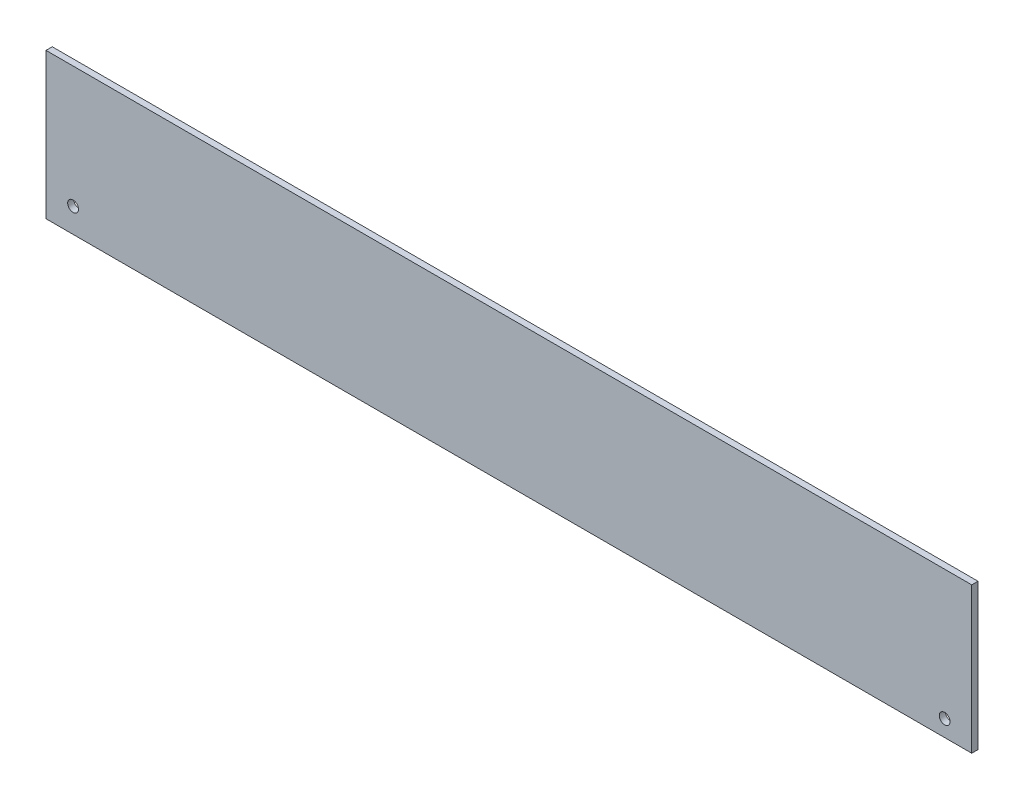
ISO-10303-21;
HEADER;
FILE_DESCRIPTION(('STEP AP214'),'2;1');
FILE_NAME('part.step','',(''),(''),'','','');
FILE_SCHEMA(('AUTOMOTIVE_DESIGN { 1 0 10303 214 1 1 1 1 }'));
ENDSEC;
DATA;
#1=APPLICATION_CONTEXT('core data for automotive mechanical design processes');
#2=APPLICATION_PROTOCOL_DEFINITION('international standard','automotive_design',2000,#1);
#3=PRODUCT_CONTEXT('',#1,'mechanical');
#4=PRODUCT('Part','Part','',(#3));
#5=PRODUCT_RELATED_PRODUCT_CATEGORY('part','',(#4));
#6=PRODUCT_DEFINITION_FORMATION('','',#4);
#7=PRODUCT_DEFINITION_CONTEXT('part definition',#1,'design');
#8=PRODUCT_DEFINITION('design','',#6,#7);
#9=PRODUCT_DEFINITION_SHAPE('','',#8);
#10=(LENGTH_UNIT() NAMED_UNIT(*) SI_UNIT(.MILLI.,.METRE.));
#11=(NAMED_UNIT(*) PLANE_ANGLE_UNIT() SI_UNIT($,.RADIAN.));
#12=(NAMED_UNIT(*) SI_UNIT($,.STERADIAN.) SOLID_ANGLE_UNIT());
#13=UNCERTAINTY_MEASURE_WITH_UNIT(LENGTH_MEASURE(1.E-05),#10,'distance_accuracy_value','');
#14=(GEOMETRIC_REPRESENTATION_CONTEXT(3) GLOBAL_UNCERTAINTY_ASSIGNED_CONTEXT((#13)) GLOBAL_UNIT_ASSIGNED_CONTEXT((#10,
#11,#12)) REPRESENTATION_CONTEXT('',''));
#15=CARTESIAN_POINT('',(0.,0.,0.));
#16=DIRECTION('',(0.,0.,1.));
#17=DIRECTION('',(1.,0.,0.));
#18=AXIS2_PLACEMENT_3D('',#15,#16,#17);
#19=CARTESIAN_POINT('',(0.,0.,3.));
#20=DIRECTION('',(-1.,0.,0.));
#21=DIRECTION('',(0.,0.,1.));
#22=AXIS2_PLACEMENT_3D('',#19,#20,#21);
#23=PLANE('',#22);
#24=DIRECTION('',(0.,1.,0.));
#25=VECTOR('',#24,1.);
#26=CARTESIAN_POINT('',(0.,0.,0.));
#27=LINE('',#26,#25);
#28=CARTESIAN_POINT('',(0.,0.,0.));
#29=VERTEX_POINT('',#28);
#30=CARTESIAN_POINT('',(0.,70.,0.));
#31=VERTEX_POINT('',#30);
#32=EDGE_CURVE('E98',#29,#31,#27,.T.);
#33=ORIENTED_EDGE('',*,*,#32,.T.);
#34=DIRECTION('',(0.,0.,-1.));
#35=VECTOR('',#34,1.);
#36=CARTESIAN_POINT('',(0.,70.,3.));
#37=LINE('',#36,#35);
#38=CARTESIAN_POINT('',(0.,70.,3.));
#39=VERTEX_POINT('',#38);
#40=EDGE_CURVE('E11',#39,#31,#37,.T.);
#41=ORIENTED_EDGE('',*,*,#40,.F.);
#42=DIRECTION('',(0.,1.,0.));
#43=VECTOR('',#42,1.);
#44=CARTESIAN_POINT('',(0.,0.,3.));
#45=LINE('',#44,#43);
#46=CARTESIAN_POINT('',(0.,0.,3.));
#47=VERTEX_POINT('',#46);
#48=EDGE_CURVE('E86',#47,#39,#45,.T.);
#49=ORIENTED_EDGE('',*,*,#48,.F.);
#50=DIRECTION('',(0.,0.,-1.));
#51=VECTOR('',#50,1.);
#52=CARTESIAN_POINT('',(0.,0.,3.));
#53=LINE('',#52,#51);
#54=EDGE_CURVE('E94',#47,#29,#53,.T.);
#55=ORIENTED_EDGE('',*,*,#54,.T.);
#56=EDGE_LOOP('',(#33,#41,#49,#55));
#57=FACE_BOUND('',#56,.T.);
#58=ADVANCED_FACE('F35',(#57),#23,.F.);
#59=CARTESIAN_POINT('',(0.,70.,3.));
#60=DIRECTION('',(0.,-1.,0.));
#61=DIRECTION('',(1.,0.,0.));
#62=AXIS2_PLACEMENT_3D('',#59,#60,#61);
#63=PLANE('',#62);
#64=DIRECTION('',(-1.,0.,0.));
#65=VECTOR('',#64,1.);
#66=CARTESIAN_POINT('',(0.,70.,0.));
#67=LINE('',#66,#65);
#68=CARTESIAN_POINT('',(-444.3,70.,0.));
#69=VERTEX_POINT('',#68);
#70=EDGE_CURVE('E90',#31,#69,#67,.T.);
#71=ORIENTED_EDGE('',*,*,#70,.T.);
#72=DIRECTION('',(0.,0.,-1.));
#73=VECTOR('',#72,1.);
#74=CARTESIAN_POINT('',(-444.3,70.,3.));
#75=LINE('',#74,#73);
#76=CARTESIAN_POINT('',(-444.3,70.,3.));
#77=VERTEX_POINT('',#76);
#78=EDGE_CURVE('E43',#77,#69,#75,.T.);
#79=ORIENTED_EDGE('',*,*,#78,.F.);
#80=DIRECTION('',(-1.,0.,0.));
#81=VECTOR('',#80,1.);
#82=CARTESIAN_POINT('',(0.,70.,3.));
#83=LINE('',#82,#81);
#84=EDGE_CURVE('E81',#39,#77,#83,.T.);
#85=ORIENTED_EDGE('',*,*,#84,.F.);
#86=ORIENTED_EDGE('',*,*,#40,.T.);
#87=EDGE_LOOP('',(#71,#79,#85,#86));
#88=FACE_BOUND('',#87,.T.);
#89=ADVANCED_FACE('F89',(#88),#63,.F.);
#90=CARTESIAN_POINT('',(-444.3,0.,3.));
#91=DIRECTION('',(1.,0.,0.));
#92=DIRECTION('',(0.,0.,-1.));
#93=AXIS2_PLACEMENT_3D('',#90,#91,#92);
#94=PLANE('',#93);
#95=DIRECTION('',(0.,-1.,0.));
#96=VECTOR('',#95,1.);
#97=CARTESIAN_POINT('',(-444.3,0.,0.));
#98=LINE('',#97,#96);
#99=CARTESIAN_POINT('',(-444.3,0.,0.));
#100=VERTEX_POINT('',#99);
#101=EDGE_CURVE('E68',#69,#100,#98,.T.);
#102=ORIENTED_EDGE('',*,*,#101,.T.);
#103=DIRECTION('',(0.,0.,-1.));
#104=VECTOR('',#103,1.);
#105=CARTESIAN_POINT('',(-444.3,0.,3.));
#106=LINE('',#105,#104);
#107=CARTESIAN_POINT('',(-444.3,0.,3.));
#108=VERTEX_POINT('',#107);
#109=EDGE_CURVE('E91',#108,#100,#106,.T.);
#110=ORIENTED_EDGE('',*,*,#109,.F.);
#111=DIRECTION('',(0.,-1.,0.));
#112=VECTOR('',#111,1.);
#113=CARTESIAN_POINT('',(-444.3,0.,3.));
#114=LINE('',#113,#112);
#115=EDGE_CURVE('E84',#77,#108,#114,.T.);
#116=ORIENTED_EDGE('',*,*,#115,.F.);
#117=ORIENTED_EDGE('',*,*,#78,.T.);
#118=EDGE_LOOP('',(#102,#110,#116,#117));
#119=FACE_BOUND('',#118,.T.);
#120=ADVANCED_FACE('F92',(#119),#94,.F.);
#121=CARTESIAN_POINT('',(0.,0.,3.));
#122=DIRECTION('',(0.,1.,0.));
#123=DIRECTION('',(0.,0.,1.));
#124=AXIS2_PLACEMENT_3D('',#121,#122,#123);
#125=PLANE('',#124);
#126=DIRECTION('',(1.,0.,0.));
#127=VECTOR('',#126,1.);
#128=CARTESIAN_POINT('',(0.,0.,0.));
#129=LINE('',#128,#127);
#130=EDGE_CURVE('E74',#100,#29,#129,.T.);
#131=ORIENTED_EDGE('',*,*,#130,.T.);
#132=ORIENTED_EDGE('',*,*,#54,.F.);
#133=DIRECTION('',(1.,0.,0.));
#134=VECTOR('',#133,1.);
#135=CARTESIAN_POINT('',(0.,0.,3.));
#136=LINE('',#135,#134);
#137=EDGE_CURVE('E51',#108,#47,#136,.T.);
#138=ORIENTED_EDGE('',*,*,#137,.F.);
#139=ORIENTED_EDGE('',*,*,#109,.T.);
#140=EDGE_LOOP('',(#131,#132,#138,#139));
#141=FACE_BOUND('',#140,.T.);
#142=ADVANCED_FACE('F106',(#141),#125,.F.);
#143=CARTESIAN_POINT('',(0.,0.,3.));
#144=DIRECTION('',(0.,0.,1.));
#145=DIRECTION('',(1.,0.,0.));
#146=AXIS2_PLACEMENT_3D('',#143,#144,#145);
#147=PLANE('',#146);
#148=CARTESIAN_POINT('',(-13.,7.8958868771398,3.));
#149=DIRECTION('',(0.,0.,1.));
#150=DIRECTION('',(1.,0.,0.));
#151=AXIS2_PLACEMENT_3D('',#148,#149,#150);
#152=CIRCLE('',#151,2.6);
#153=CARTESIAN_POINT('',(-10.4,7.8958868771398,3.));
#154=VERTEX_POINT('',#153);
#155=EDGE_CURVE('E101',#154,#154,#152,.T.);
#156=ORIENTED_EDGE('',*,*,#155,.F.);
#157=EDGE_LOOP('',(#156));
#158=FACE_BOUND('',#157,.T.);
#159=CARTESIAN_POINT('',(-431.3,11.7217193680234,3.));
#160=DIRECTION('',(0.,0.,1.));
#161=DIRECTION('',(1.,0.,0.));
#162=AXIS2_PLACEMENT_3D('',#159,#160,#161);
#163=CIRCLE('',#162,2.60000000000002);
#164=CARTESIAN_POINT('',(-428.7,11.7217193680234,3.));
#165=VERTEX_POINT('',#164);
#166=EDGE_CURVE('E114',#165,#165,#163,.T.);
#167=ORIENTED_EDGE('',*,*,#166,.F.);
#168=EDGE_LOOP('',(#167));
#169=FACE_BOUND('',#168,.T.);
#170=ORIENTED_EDGE('',*,*,#48,.T.);
#171=ORIENTED_EDGE('',*,*,#84,.T.);
#172=ORIENTED_EDGE('',*,*,#115,.T.);
#173=ORIENTED_EDGE('',*,*,#137,.T.);
#174=EDGE_LOOP('',(#170,#171,#172,#173));
#175=FACE_BOUND('',#174,.T.);
#176=ADVANCED_FACE('F82',(#158,#169,#175),#147,.T.);
#177=CARTESIAN_POINT('',(0.,0.,0.));
#178=DIRECTION('',(0.,0.,1.));
#179=DIRECTION('',(1.,0.,0.));
#180=AXIS2_PLACEMENT_3D('',#177,#178,#179);
#181=PLANE('',#180);
#182=CARTESIAN_POINT('',(-13.,7.8958868771398,0.));
#183=DIRECTION('',(0.,0.,-1.));
#184=DIRECTION('',(-1.,0.,0.));
#185=AXIS2_PLACEMENT_3D('',#182,#183,#184);
#186=CIRCLE('',#185,2.6);
#187=CARTESIAN_POINT('',(-15.6,7.8958868771398,0.));
#188=VERTEX_POINT('',#187);
#189=EDGE_CURVE('E117',#188,#188,#186,.T.);
#190=ORIENTED_EDGE('',*,*,#189,.F.);
#191=EDGE_LOOP('',(#190));
#192=FACE_BOUND('',#191,.T.);
#193=CARTESIAN_POINT('',(-431.3,11.7217193680234,0.));
#194=DIRECTION('',(0.,0.,-1.));
#195=DIRECTION('',(-1.,0.,0.));
#196=AXIS2_PLACEMENT_3D('',#193,#194,#195);
#197=CIRCLE('',#196,2.60000000000002);
#198=CARTESIAN_POINT('',(-433.9,11.7217193680234,0.));
#199=VERTEX_POINT('',#198);
#200=EDGE_CURVE('E118',#199,#199,#197,.T.);
#201=ORIENTED_EDGE('',*,*,#200,.F.);
#202=EDGE_LOOP('',(#201));
#203=FACE_BOUND('',#202,.T.);
#204=ORIENTED_EDGE('',*,*,#32,.F.);
#205=ORIENTED_EDGE('',*,*,#130,.F.);
#206=ORIENTED_EDGE('',*,*,#101,.F.);
#207=ORIENTED_EDGE('',*,*,#70,.F.);
#208=EDGE_LOOP('',(#204,#205,#206,#207));
#209=FACE_BOUND('',#208,.T.);
#210=ADVANCED_FACE('F109',(#192,#203,#209),#181,.F.);
#211=CARTESIAN_POINT('',(-431.3,11.7217193680234,20.));
#212=DIRECTION('',(0.,0.,-1.));
#213=DIRECTION('',(-1.,0.,0.));
#214=AXIS2_PLACEMENT_3D('',#211,#212,#213);
#215=CYLINDRICAL_SURFACE('',#214,2.60000000000002);
#216=ORIENTED_EDGE('',*,*,#166,.T.);
#217=EDGE_LOOP('',(#216));
#218=FACE_BOUND('',#217,.T.);
#219=ORIENTED_EDGE('',*,*,#200,.T.);
#220=EDGE_LOOP('',(#219));
#221=FACE_BOUND('',#220,.T.);
#222=ADVANCED_FACE('F128',(#218,#221),#215,.F.);
#223=CARTESIAN_POINT('',(-13.,7.8958868771398,20.));
#224=DIRECTION('',(0.,0.,-1.));
#225=DIRECTION('',(-1.,0.,0.));
#226=AXIS2_PLACEMENT_3D('',#223,#224,#225);
#227=CYLINDRICAL_SURFACE('',#226,2.6);
#228=ORIENTED_EDGE('',*,*,#155,.T.);
#229=EDGE_LOOP('',(#228));
#230=FACE_BOUND('',#229,.T.);
#231=ORIENTED_EDGE('',*,*,#189,.T.);
#232=EDGE_LOOP('',(#231));
#233=FACE_BOUND('',#232,.T.);
#234=ADVANCED_FACE('F124',(#230,#233),#227,.F.);
#235=CLOSED_SHELL('',(#58,#89,#120,#142,#176,#210,#222,#234));
#236=MANIFOLD_SOLID_BREP('B2',#235);
#237=ADVANCED_BREP_SHAPE_REPRESENTATION('',(#18,#236),#14);
#238=SHAPE_DEFINITION_REPRESENTATION(#9,#237);
ENDSEC;
END-ISO-10303-21;
